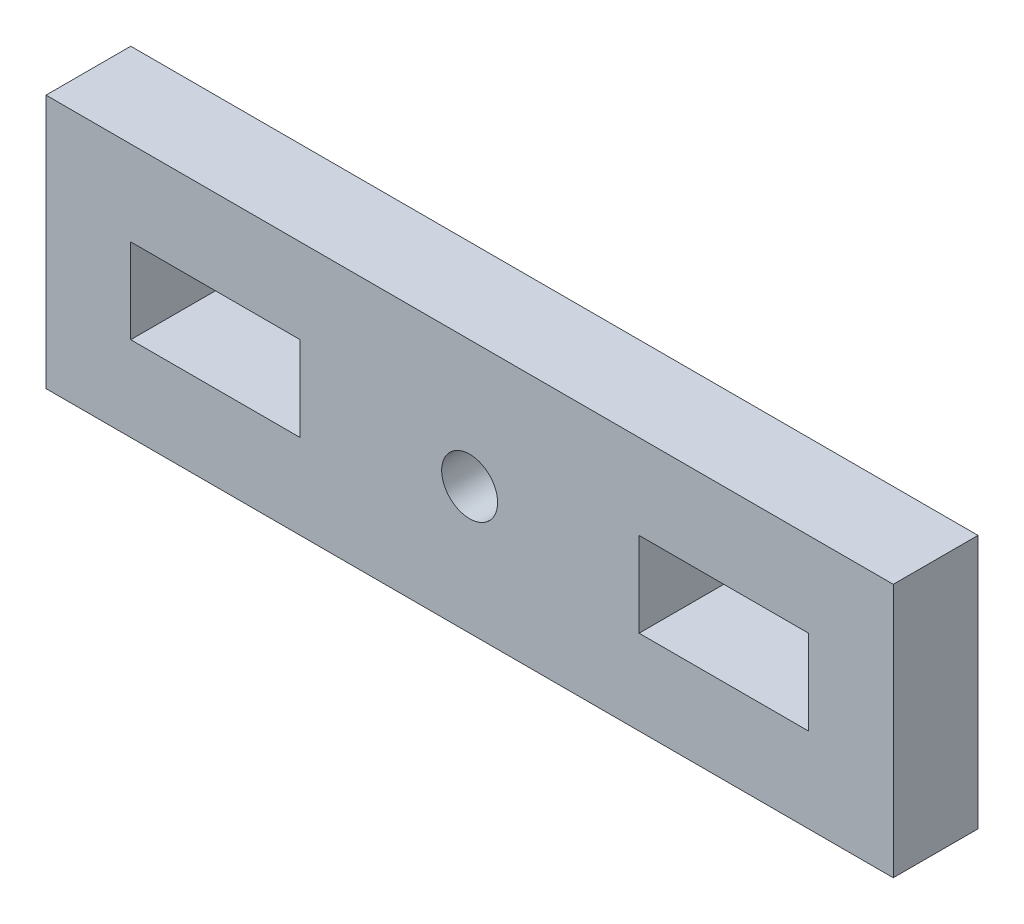
ISO-10303-21;
HEADER;
FILE_DESCRIPTION(('STEP AP214'),'2;1');
FILE_NAME('part.step','',(''),(''),'','','');
FILE_SCHEMA(('AUTOMOTIVE_DESIGN { 1 0 10303 214 1 1 1 1 }'));
ENDSEC;
DATA;
#1=APPLICATION_CONTEXT('core data for automotive mechanical design processes');
#2=APPLICATION_PROTOCOL_DEFINITION('international standard','automotive_design',2000,#1);
#3=PRODUCT_CONTEXT('',#1,'mechanical');
#4=PRODUCT('Part','Part','',(#3));
#5=PRODUCT_RELATED_PRODUCT_CATEGORY('part','',(#4));
#6=PRODUCT_DEFINITION_FORMATION('','',#4);
#7=PRODUCT_DEFINITION_CONTEXT('part definition',#1,'design');
#8=PRODUCT_DEFINITION('design','',#6,#7);
#9=PRODUCT_DEFINITION_SHAPE('','',#8);
#10=(LENGTH_UNIT() NAMED_UNIT(*) SI_UNIT(.MILLI.,.METRE.));
#11=(NAMED_UNIT(*) PLANE_ANGLE_UNIT() SI_UNIT($,.RADIAN.));
#12=(NAMED_UNIT(*) SI_UNIT($,.STERADIAN.) SOLID_ANGLE_UNIT());
#13=UNCERTAINTY_MEASURE_WITH_UNIT(LENGTH_MEASURE(1.E-05),#10,'distance_accuracy_value','');
#14=(GEOMETRIC_REPRESENTATION_CONTEXT(3) GLOBAL_UNCERTAINTY_ASSIGNED_CONTEXT((#13)) GLOBAL_UNIT_ASSIGNED_CONTEXT((#10,
#11,#12)) REPRESENTATION_CONTEXT('',''));
#15=CARTESIAN_POINT('',(0.,0.,0.));
#16=DIRECTION('',(0.,0.,1.));
#17=DIRECTION('',(1.,0.,0.));
#18=AXIS2_PLACEMENT_3D('',#15,#16,#17);
#19=CARTESIAN_POINT('',(31.75,-9.525,6.35));
#20=DIRECTION('',(-1.,0.,0.));
#21=DIRECTION('',(0.,0.,1.));
#22=AXIS2_PLACEMENT_3D('',#19,#20,#21);
#23=PLANE('',#22);
#24=DIRECTION('',(0.,1.,0.));
#25=VECTOR('',#24,1.);
#26=CARTESIAN_POINT('',(31.75,-9.525,0.));
#27=LINE('',#26,#25);
#28=CARTESIAN_POINT('',(31.75,-9.525,0.));
#29=VERTEX_POINT('',#28);
#30=CARTESIAN_POINT('',(31.75,9.525,0.));
#31=VERTEX_POINT('',#30);
#32=EDGE_CURVE('E193',#29,#31,#27,.T.);
#33=ORIENTED_EDGE('',*,*,#32,.T.);
#34=DIRECTION('',(0.,0.,-1.));
#35=VECTOR('',#34,1.);
#36=CARTESIAN_POINT('',(31.75,9.525,6.35));
#37=LINE('',#36,#35);
#38=CARTESIAN_POINT('',(31.75,9.525,6.35));
#39=VERTEX_POINT('',#38);
#40=EDGE_CURVE('E11',#39,#31,#37,.T.);
#41=ORIENTED_EDGE('',*,*,#40,.F.);
#42=DIRECTION('',(0.,1.,0.));
#43=VECTOR('',#42,1.);
#44=CARTESIAN_POINT('',(31.75,-9.525,6.35));
#45=LINE('',#44,#43);
#46=CARTESIAN_POINT('',(31.75,-9.525,6.35));
#47=VERTEX_POINT('',#46);
#48=EDGE_CURVE('E196',#47,#39,#45,.T.);
#49=ORIENTED_EDGE('',*,*,#48,.F.);
#50=DIRECTION('',(0.,0.,-1.));
#51=VECTOR('',#50,1.);
#52=CARTESIAN_POINT('',(31.75,-9.525,6.35));
#53=LINE('',#52,#51);
#54=EDGE_CURVE('E206',#47,#29,#53,.T.);
#55=ORIENTED_EDGE('',*,*,#54,.T.);
#56=EDGE_LOOP('',(#33,#41,#49,#55));
#57=FACE_BOUND('',#56,.T.);
#58=ADVANCED_FACE('F33',(#57),#23,.F.);
#59=CARTESIAN_POINT('',(-31.75,9.525,6.35));
#60=DIRECTION('',(0.,-1.,0.));
#61=DIRECTION('',(0.,0.,-1.));
#62=AXIS2_PLACEMENT_3D('',#59,#60,#61);
#63=PLANE('',#62);
#64=DIRECTION('',(-1.,0.,0.));
#65=VECTOR('',#64,1.);
#66=CARTESIAN_POINT('',(-31.75,9.525,0.));
#67=LINE('',#66,#65);
#68=CARTESIAN_POINT('',(-31.75,9.525,0.));
#69=VERTEX_POINT('',#68);
#70=EDGE_CURVE('E209',#31,#69,#67,.T.);
#71=ORIENTED_EDGE('',*,*,#70,.T.);
#72=DIRECTION('',(0.,0.,-1.));
#73=VECTOR('',#72,1.);
#74=CARTESIAN_POINT('',(-31.75,9.525,6.35));
#75=LINE('',#74,#73);
#76=CARTESIAN_POINT('',(-31.75,9.525,6.35));
#77=VERTEX_POINT('',#76);
#78=EDGE_CURVE('E40',#77,#69,#75,.T.);
#79=ORIENTED_EDGE('',*,*,#78,.F.);
#80=DIRECTION('',(-1.,0.,0.));
#81=VECTOR('',#80,1.);
#82=CARTESIAN_POINT('',(-31.75,9.525,6.35));
#83=LINE('',#82,#81);
#84=EDGE_CURVE('E199',#39,#77,#83,.T.);
#85=ORIENTED_EDGE('',*,*,#84,.F.);
#86=ORIENTED_EDGE('',*,*,#40,.T.);
#87=EDGE_LOOP('',(#71,#79,#85,#86));
#88=FACE_BOUND('',#87,.T.);
#89=ADVANCED_FACE('F238',(#88),#63,.F.);
#90=CARTESIAN_POINT('',(-31.75,-9.525,6.35));
#91=DIRECTION('',(1.,0.,0.));
#92=DIRECTION('',(0.,0.,-1.));
#93=AXIS2_PLACEMENT_3D('',#90,#91,#92);
#94=PLANE('',#93);
#95=DIRECTION('',(0.,-1.,0.));
#96=VECTOR('',#95,1.);
#97=CARTESIAN_POINT('',(-31.75,-9.525,0.));
#98=LINE('',#97,#96);
#99=CARTESIAN_POINT('',(-31.75,-9.525,0.));
#100=VERTEX_POINT('',#99);
#101=EDGE_CURVE('E211',#69,#100,#98,.T.);
#102=ORIENTED_EDGE('',*,*,#101,.T.);
#103=DIRECTION('',(0.,0.,-1.));
#104=VECTOR('',#103,1.);
#105=CARTESIAN_POINT('',(-31.75,-9.525,6.35));
#106=LINE('',#105,#104);
#107=CARTESIAN_POINT('',(-31.75,-9.525,6.35));
#108=VERTEX_POINT('',#107);
#109=EDGE_CURVE('E216',#108,#100,#106,.T.);
#110=ORIENTED_EDGE('',*,*,#109,.F.);
#111=DIRECTION('',(0.,-1.,0.));
#112=VECTOR('',#111,1.);
#113=CARTESIAN_POINT('',(-31.75,-9.525,6.35));
#114=LINE('',#113,#112);
#115=EDGE_CURVE('E202',#77,#108,#114,.T.);
#116=ORIENTED_EDGE('',*,*,#115,.F.);
#117=ORIENTED_EDGE('',*,*,#78,.T.);
#118=EDGE_LOOP('',(#102,#110,#116,#117));
#119=FACE_BOUND('',#118,.T.);
#120=ADVANCED_FACE('F223',(#119),#94,.F.);
#121=CARTESIAN_POINT('',(-31.75,-9.525,6.35));
#122=DIRECTION('',(0.,1.,0.));
#123=DIRECTION('',(0.,0.,1.));
#124=AXIS2_PLACEMENT_3D('',#121,#122,#123);
#125=PLANE('',#124);
#126=DIRECTION('',(1.,0.,0.));
#127=VECTOR('',#126,1.);
#128=CARTESIAN_POINT('',(-31.75,-9.525,0.));
#129=LINE('',#128,#127);
#130=EDGE_CURVE('E200',#100,#29,#129,.T.);
#131=ORIENTED_EDGE('',*,*,#130,.T.);
#132=ORIENTED_EDGE('',*,*,#54,.F.);
#133=DIRECTION('',(1.,0.,0.));
#134=VECTOR('',#133,1.);
#135=CARTESIAN_POINT('',(-31.75,-9.525,6.35));
#136=LINE('',#135,#134);
#137=EDGE_CURVE('E204',#108,#47,#136,.T.);
#138=ORIENTED_EDGE('',*,*,#137,.F.);
#139=ORIENTED_EDGE('',*,*,#109,.T.);
#140=EDGE_LOOP('',(#131,#132,#138,#139));
#141=FACE_BOUND('',#140,.T.);
#142=ADVANCED_FACE('F231',(#141),#125,.F.);
#143=CARTESIAN_POINT('',(0.,0.,6.35));
#144=DIRECTION('',(0.,0.,-1.));
#145=DIRECTION('',(-1.,0.,0.));
#146=AXIS2_PLACEMENT_3D('',#143,#144,#145);
#147=PLANE('',#146);
#148=DIRECTION('',(1.,0.,0.));
#149=VECTOR('',#148,1.);
#150=CARTESIAN_POINT('',(12.7,-3.175,6.35));
#151=LINE('',#150,#149);
#152=CARTESIAN_POINT('',(12.7,-3.175,6.35));
#153=VERTEX_POINT('',#152);
#154=CARTESIAN_POINT('',(25.4,-3.175,6.35));
#155=VERTEX_POINT('',#154);
#156=EDGE_CURVE('E148',#153,#155,#151,.T.);
#157=ORIENTED_EDGE('',*,*,#156,.F.);
#158=DIRECTION('',(0.,-1.,0.));
#159=VECTOR('',#158,1.);
#160=CARTESIAN_POINT('',(12.7,3.175,6.35));
#161=LINE('',#160,#159);
#162=CARTESIAN_POINT('',(12.7,3.175,6.35));
#163=VERTEX_POINT('',#162);
#164=EDGE_CURVE('E47',#163,#153,#161,.T.);
#165=ORIENTED_EDGE('',*,*,#164,.F.);
#166=DIRECTION('',(-1.,0.,0.));
#167=VECTOR('',#166,1.);
#168=CARTESIAN_POINT('',(12.7,3.175,6.35));
#169=LINE('',#168,#167);
#170=CARTESIAN_POINT('',(25.4,3.175,6.35));
#171=VERTEX_POINT('',#170);
#172=EDGE_CURVE('E139',#171,#163,#169,.T.);
#173=ORIENTED_EDGE('',*,*,#172,.F.);
#174=DIRECTION('',(0.,1.,0.));
#175=VECTOR('',#174,1.);
#176=CARTESIAN_POINT('',(25.4,3.175,6.35));
#177=LINE('',#176,#175);
#178=EDGE_CURVE('E142',#155,#171,#177,.T.);
#179=ORIENTED_EDGE('',*,*,#178,.F.);
#180=EDGE_LOOP('',(#157,#165,#173,#179));
#181=FACE_BOUND('',#180,.T.);
#182=DIRECTION('',(1.,0.,0.));
#183=VECTOR('',#182,1.);
#184=CARTESIAN_POINT('',(-25.4,-3.175,6.35));
#185=LINE('',#184,#183);
#186=CARTESIAN_POINT('',(-25.4,-3.175,6.35));
#187=VERTEX_POINT('',#186);
#188=CARTESIAN_POINT('',(-12.7,-3.175,6.35));
#189=VERTEX_POINT('',#188);
#190=EDGE_CURVE('E173',#187,#189,#185,.T.);
#191=ORIENTED_EDGE('',*,*,#190,.F.);
#192=DIRECTION('',(0.,-1.,0.));
#193=VECTOR('',#192,1.);
#194=CARTESIAN_POINT('',(-25.4,3.175,6.35));
#195=LINE('',#194,#193);
#196=CARTESIAN_POINT('',(-25.4,3.175,6.35));
#197=VERTEX_POINT('',#196);
#198=EDGE_CURVE('E154',#197,#187,#195,.T.);
#199=ORIENTED_EDGE('',*,*,#198,.F.);
#200=DIRECTION('',(-1.,0.,0.));
#201=VECTOR('',#200,1.);
#202=CARTESIAN_POINT('',(-25.4,3.175,6.35));
#203=LINE('',#202,#201);
#204=CARTESIAN_POINT('',(-12.7,3.175,6.35));
#205=VERTEX_POINT('',#204);
#206=EDGE_CURVE('E162',#205,#197,#203,.T.);
#207=ORIENTED_EDGE('',*,*,#206,.F.);
#208=DIRECTION('',(0.,1.,0.));
#209=VECTOR('',#208,1.);
#210=CARTESIAN_POINT('',(-12.7,3.175,6.35));
#211=LINE('',#210,#209);
#212=EDGE_CURVE('E176',#189,#205,#211,.T.);
#213=ORIENTED_EDGE('',*,*,#212,.F.);
#214=EDGE_LOOP('',(#191,#199,#207,#213));
#215=FACE_BOUND('',#214,.T.);
#216=CARTESIAN_POINT('',(0.,0.,6.35));
#217=DIRECTION('',(0.,0.,1.));
#218=DIRECTION('',(1.,0.,0.));
#219=AXIS2_PLACEMENT_3D('',#216,#217,#218);
#220=CIRCLE('',#219,2.0955);
#221=CARTESIAN_POINT('',(2.09550000000001,0.,6.35));
#222=VERTEX_POINT('',#221);
#223=EDGE_CURVE('E183',#222,#222,#220,.T.);
#224=ORIENTED_EDGE('',*,*,#223,.F.);
#225=EDGE_LOOP('',(#224));
#226=FACE_BOUND('',#225,.T.);
#227=ORIENTED_EDGE('',*,*,#48,.T.);
#228=ORIENTED_EDGE('',*,*,#84,.T.);
#229=ORIENTED_EDGE('',*,*,#115,.T.);
#230=ORIENTED_EDGE('',*,*,#137,.T.);
#231=EDGE_LOOP('',(#227,#228,#229,#230));
#232=FACE_BOUND('',#231,.T.);
#233=ADVANCED_FACE('F237',(#181,#215,#226,#232),#147,.F.);
#234=CARTESIAN_POINT('',(0.,0.,0.));
#235=DIRECTION('',(0.,0.,-1.));
#236=DIRECTION('',(-1.,0.,0.));
#237=AXIS2_PLACEMENT_3D('',#234,#235,#236);
#238=PLANE('',#237);
#239=DIRECTION('',(0.,-1.,0.));
#240=VECTOR('',#239,1.);
#241=CARTESIAN_POINT('',(12.7,3.175,0.));
#242=LINE('',#241,#240);
#243=CARTESIAN_POINT('',(12.7,3.175,0.));
#244=VERTEX_POINT('',#243);
#245=CARTESIAN_POINT('',(12.7,-3.175,0.));
#246=VERTEX_POINT('',#245);
#247=EDGE_CURVE('E123',#244,#246,#242,.T.);
#248=ORIENTED_EDGE('',*,*,#247,.T.);
#249=DIRECTION('',(1.,0.,0.));
#250=VECTOR('',#249,1.);
#251=CARTESIAN_POINT('',(12.7,-3.175,0.));
#252=LINE('',#251,#250);
#253=CARTESIAN_POINT('',(25.4,-3.175,0.));
#254=VERTEX_POINT('',#253);
#255=EDGE_CURVE('E132',#246,#254,#252,.T.);
#256=ORIENTED_EDGE('',*,*,#255,.T.);
#257=DIRECTION('',(0.,1.,0.));
#258=VECTOR('',#257,1.);
#259=CARTESIAN_POINT('',(25.4,3.175,0.));
#260=LINE('',#259,#258);
#261=CARTESIAN_POINT('',(25.4,3.175,0.));
#262=VERTEX_POINT('',#261);
#263=EDGE_CURVE('E55',#254,#262,#260,.T.);
#264=ORIENTED_EDGE('',*,*,#263,.T.);
#265=DIRECTION('',(-1.,0.,0.));
#266=VECTOR('',#265,1.);
#267=CARTESIAN_POINT('',(12.7,3.175,0.));
#268=LINE('',#267,#266);
#269=EDGE_CURVE('E129',#262,#244,#268,.T.);
#270=ORIENTED_EDGE('',*,*,#269,.T.);
#271=EDGE_LOOP('',(#248,#256,#264,#270));
#272=FACE_BOUND('',#271,.T.);
#273=DIRECTION('',(0.,-1.,0.));
#274=VECTOR('',#273,1.);
#275=CARTESIAN_POINT('',(-25.4,3.175,0.));
#276=LINE('',#275,#274);
#277=CARTESIAN_POINT('',(-25.4,3.175,0.));
#278=VERTEX_POINT('',#277);
#279=CARTESIAN_POINT('',(-25.4,-3.175,0.));
#280=VERTEX_POINT('',#279);
#281=EDGE_CURVE('E158',#278,#280,#276,.T.);
#282=ORIENTED_EDGE('',*,*,#281,.T.);
#283=DIRECTION('',(1.,0.,0.));
#284=VECTOR('',#283,1.);
#285=CARTESIAN_POINT('',(-25.4,-3.175,0.));
#286=LINE('',#285,#284);
#287=CARTESIAN_POINT('',(-12.7,-3.175,0.));
#288=VERTEX_POINT('',#287);
#289=EDGE_CURVE('E161',#280,#288,#286,.T.);
#290=ORIENTED_EDGE('',*,*,#289,.T.);
#291=DIRECTION('',(0.,1.,0.));
#292=VECTOR('',#291,1.);
#293=CARTESIAN_POINT('',(-12.7,3.175,0.));
#294=LINE('',#293,#292);
#295=CARTESIAN_POINT('',(-12.7,3.175,0.));
#296=VERTEX_POINT('',#295);
#297=EDGE_CURVE('E165',#288,#296,#294,.T.);
#298=ORIENTED_EDGE('',*,*,#297,.T.);
#299=DIRECTION('',(-1.,0.,0.));
#300=VECTOR('',#299,1.);
#301=CARTESIAN_POINT('',(-25.4,3.175,0.));
#302=LINE('',#301,#300);
#303=EDGE_CURVE('E168',#296,#278,#302,.T.);
#304=ORIENTED_EDGE('',*,*,#303,.T.);
#305=EDGE_LOOP('',(#282,#290,#298,#304));
#306=FACE_BOUND('',#305,.T.);
#307=CARTESIAN_POINT('',(0.,0.,0.));
#308=DIRECTION('',(0.,0.,1.));
#309=DIRECTION('',(1.,0.,0.));
#310=AXIS2_PLACEMENT_3D('',#307,#308,#309);
#311=CIRCLE('',#310,2.0955);
#312=CARTESIAN_POINT('',(2.09550000000001,0.,0.));
#313=VERTEX_POINT('',#312);
#314=EDGE_CURVE('E190',#313,#313,#311,.T.);
#315=ORIENTED_EDGE('',*,*,#314,.T.);
#316=EDGE_LOOP('',(#315));
#317=FACE_BOUND('',#316,.T.);
#318=ORIENTED_EDGE('',*,*,#32,.F.);
#319=ORIENTED_EDGE('',*,*,#130,.F.);
#320=ORIENTED_EDGE('',*,*,#101,.F.);
#321=ORIENTED_EDGE('',*,*,#70,.F.);
#322=EDGE_LOOP('',(#318,#319,#320,#321));
#323=FACE_BOUND('',#322,.T.);
#324=ADVANCED_FACE('F136',(#272,#306,#317,#323),#238,.T.);
#325=CARTESIAN_POINT('',(0.,0.,0.));
#326=DIRECTION('',(0.,0.,1.));
#327=DIRECTION('',(1.,0.,0.));
#328=AXIS2_PLACEMENT_3D('',#325,#326,#327);
#329=CYLINDRICAL_SURFACE('',#328,2.0955);
#330=ORIENTED_EDGE('',*,*,#314,.F.);
#331=EDGE_LOOP('',(#330));
#332=FACE_BOUND('',#331,.T.);
#333=ORIENTED_EDGE('',*,*,#223,.T.);
#334=EDGE_LOOP('',(#333));
#335=FACE_BOUND('',#334,.T.);
#336=ADVANCED_FACE('F250',(#332,#335),#329,.F.);
#337=CARTESIAN_POINT('',(-25.4,3.175,0.));
#338=DIRECTION('',(-1.,0.,0.));
#339=DIRECTION('',(0.,0.,1.));
#340=AXIS2_PLACEMENT_3D('',#337,#338,#339);
#341=PLANE('',#340);
#342=ORIENTED_EDGE('',*,*,#198,.T.);
#343=DIRECTION('',(0.,0.,1.));
#344=VECTOR('',#343,1.);
#345=CARTESIAN_POINT('',(-25.4,-3.175,0.));
#346=LINE('',#345,#344);
#347=EDGE_CURVE('E171',#280,#187,#346,.T.);
#348=ORIENTED_EDGE('',*,*,#347,.F.);
#349=ORIENTED_EDGE('',*,*,#281,.F.);
#350=DIRECTION('',(0.,0.,1.));
#351=VECTOR('',#350,1.);
#352=CARTESIAN_POINT('',(-25.4,3.175,0.));
#353=LINE('',#352,#351);
#354=EDGE_CURVE('E181',#278,#197,#353,.T.);
#355=ORIENTED_EDGE('',*,*,#354,.T.);
#356=EDGE_LOOP('',(#342,#348,#349,#355));
#357=FACE_BOUND('',#356,.T.);
#358=ADVANCED_FACE('F256',(#357),#341,.F.);
#359=CARTESIAN_POINT('',(-25.4,3.175,0.));
#360=DIRECTION('',(0.,1.,0.));
#361=DIRECTION('',(0.,0.,1.));
#362=AXIS2_PLACEMENT_3D('',#359,#360,#361);
#363=PLANE('',#362);
#364=ORIENTED_EDGE('',*,*,#206,.T.);
#365=ORIENTED_EDGE('',*,*,#354,.F.);
#366=ORIENTED_EDGE('',*,*,#303,.F.);
#367=DIRECTION('',(0.,0.,1.));
#368=VECTOR('',#367,1.);
#369=CARTESIAN_POINT('',(-12.7,3.175,0.));
#370=LINE('',#369,#368);
#371=EDGE_CURVE('E184',#296,#205,#370,.T.);
#372=ORIENTED_EDGE('',*,*,#371,.T.);
#373=EDGE_LOOP('',(#364,#365,#366,#372));
#374=FACE_BOUND('',#373,.T.);
#375=ADVANCED_FACE('F260',(#374),#363,.F.);
#376=CARTESIAN_POINT('',(-12.7,3.175,0.));
#377=DIRECTION('',(1.,0.,0.));
#378=DIRECTION('',(0.,1.,0.));
#379=AXIS2_PLACEMENT_3D('',#376,#377,#378);
#380=PLANE('',#379);
#381=ORIENTED_EDGE('',*,*,#212,.T.);
#382=ORIENTED_EDGE('',*,*,#371,.F.);
#383=ORIENTED_EDGE('',*,*,#297,.F.);
#384=DIRECTION('',(0.,0.,1.));
#385=VECTOR('',#384,1.);
#386=CARTESIAN_POINT('',(-12.7,-3.175,0.));
#387=LINE('',#386,#385);
#388=EDGE_CURVE('E186',#288,#189,#387,.T.);
#389=ORIENTED_EDGE('',*,*,#388,.T.);
#390=EDGE_LOOP('',(#381,#382,#383,#389));
#391=FACE_BOUND('',#390,.T.);
#392=ADVANCED_FACE('F265',(#391),#380,.F.);
#393=CARTESIAN_POINT('',(-25.4,-3.175,0.));
#394=DIRECTION('',(0.,-1.,0.));
#395=DIRECTION('',(0.,0.,-1.));
#396=AXIS2_PLACEMENT_3D('',#393,#394,#395);
#397=PLANE('',#396);
#398=ORIENTED_EDGE('',*,*,#190,.T.);
#399=ORIENTED_EDGE('',*,*,#388,.F.);
#400=ORIENTED_EDGE('',*,*,#289,.F.);
#401=ORIENTED_EDGE('',*,*,#347,.T.);
#402=EDGE_LOOP('',(#398,#399,#400,#401));
#403=FACE_BOUND('',#402,.T.);
#404=ADVANCED_FACE('F262',(#403),#397,.F.);
#405=CARTESIAN_POINT('',(12.7,3.175,0.));
#406=DIRECTION('',(-1.,0.,0.));
#407=DIRECTION('',(0.,-1.,0.));
#408=AXIS2_PLACEMENT_3D('',#405,#406,#407);
#409=PLANE('',#408);
#410=ORIENTED_EDGE('',*,*,#164,.T.);
#411=DIRECTION('',(0.,0.,1.));
#412=VECTOR('',#411,1.);
#413=CARTESIAN_POINT('',(12.7,-3.175,0.));
#414=LINE('',#413,#412);
#415=EDGE_CURVE('E119',#246,#153,#414,.T.);
#416=ORIENTED_EDGE('',*,*,#415,.F.);
#417=ORIENTED_EDGE('',*,*,#247,.F.);
#418=DIRECTION('',(0.,0.,1.));
#419=VECTOR('',#418,1.);
#420=CARTESIAN_POINT('',(12.7,3.175,0.));
#421=LINE('',#420,#419);
#422=EDGE_CURVE('E152',#244,#163,#421,.T.);
#423=ORIENTED_EDGE('',*,*,#422,.T.);
#424=EDGE_LOOP('',(#410,#416,#417,#423));
#425=FACE_BOUND('',#424,.T.);
#426=ADVANCED_FACE('F121',(#425),#409,.F.);
#427=CARTESIAN_POINT('',(12.7,3.175,0.));
#428=DIRECTION('',(0.,1.,0.));
#429=DIRECTION('',(0.,0.,1.));
#430=AXIS2_PLACEMENT_3D('',#427,#428,#429);
#431=PLANE('',#430);
#432=ORIENTED_EDGE('',*,*,#172,.T.);
#433=ORIENTED_EDGE('',*,*,#422,.F.);
#434=ORIENTED_EDGE('',*,*,#269,.F.);
#435=DIRECTION('',(0.,0.,1.));
#436=VECTOR('',#435,1.);
#437=CARTESIAN_POINT('',(25.4,3.175,0.));
#438=LINE('',#437,#436);
#439=EDGE_CURVE('E155',#262,#171,#438,.T.);
#440=ORIENTED_EDGE('',*,*,#439,.T.);
#441=EDGE_LOOP('',(#432,#433,#434,#440));
#442=FACE_BOUND('',#441,.T.);
#443=ADVANCED_FACE('F275',(#442),#431,.F.);
#444=CARTESIAN_POINT('',(25.4,3.175,0.));
#445=DIRECTION('',(1.,0.,0.));
#446=DIRECTION('',(0.,1.,0.));
#447=AXIS2_PLACEMENT_3D('',#444,#445,#446);
#448=PLANE('',#447);
#449=ORIENTED_EDGE('',*,*,#178,.T.);
#450=ORIENTED_EDGE('',*,*,#439,.F.);
#451=ORIENTED_EDGE('',*,*,#263,.F.);
#452=DIRECTION('',(0.,0.,1.));
#453=VECTOR('',#452,1.);
#454=CARTESIAN_POINT('',(25.4,-3.175,0.));
#455=LINE('',#454,#453);
#456=EDGE_CURVE('E128',#254,#155,#455,.T.);
#457=ORIENTED_EDGE('',*,*,#456,.T.);
#458=EDGE_LOOP('',(#449,#450,#451,#457));
#459=FACE_BOUND('',#458,.T.);
#460=ADVANCED_FACE('F278',(#459),#448,.F.);
#461=CARTESIAN_POINT('',(12.7,-3.175,0.));
#462=DIRECTION('',(0.,-1.,0.));
#463=DIRECTION('',(0.,0.,-1.));
#464=AXIS2_PLACEMENT_3D('',#461,#462,#463);
#465=PLANE('',#464);
#466=ORIENTED_EDGE('',*,*,#156,.T.);
#467=ORIENTED_EDGE('',*,*,#456,.F.);
#468=ORIENTED_EDGE('',*,*,#255,.F.);
#469=ORIENTED_EDGE('',*,*,#415,.T.);
#470=EDGE_LOOP('',(#466,#467,#468,#469));
#471=FACE_BOUND('',#470,.T.);
#472=ADVANCED_FACE('F133',(#471),#465,.F.);
#473=CLOSED_SHELL('',(#58,#89,#120,#142,#233,#324,#336,#358,#375,#392,#404,#426,#443,#460,#472));
#474=MANIFOLD_SOLID_BREP('B2',#473);
#475=ADVANCED_BREP_SHAPE_REPRESENTATION('',(#18,#474),#14);
#476=SHAPE_DEFINITION_REPRESENTATION(#9,#475);
ENDSEC;
END-ISO-10303-21;
